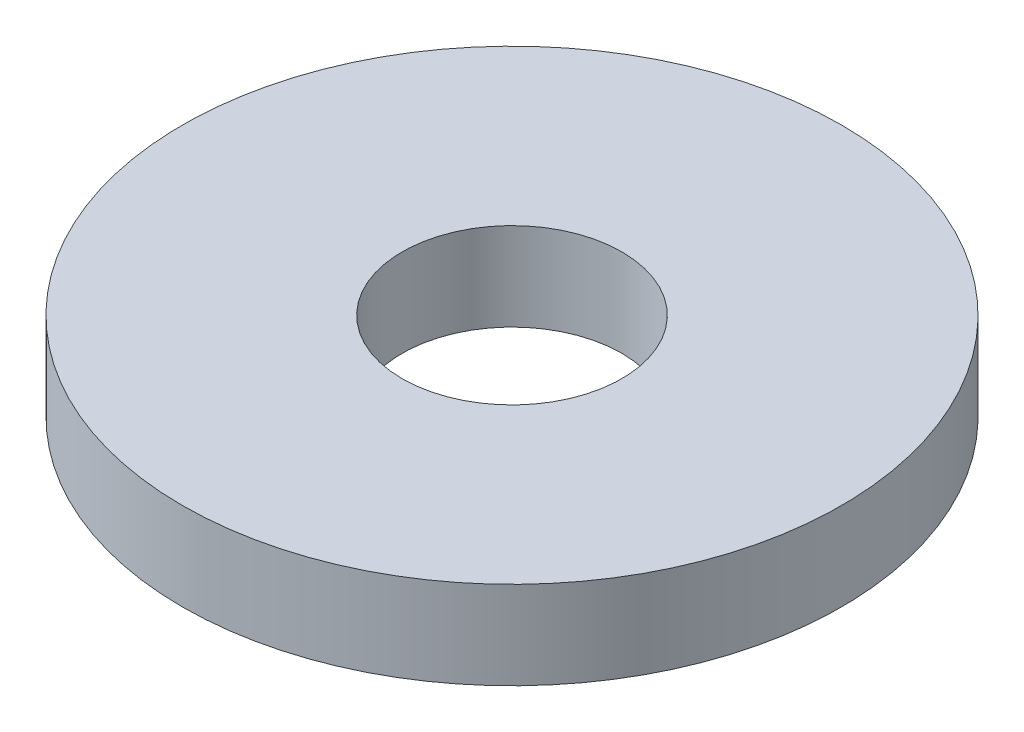
ISO-10303-21;
HEADER;
FILE_DESCRIPTION(('STEP AP214'),'2;1');
FILE_NAME('part.step','',(''),(''),'','','');
FILE_SCHEMA(('AUTOMOTIVE_DESIGN { 1 0 10303 214 1 1 1 1 }'));
ENDSEC;
DATA;
#1=APPLICATION_CONTEXT('core data for automotive mechanical design processes');
#2=APPLICATION_PROTOCOL_DEFINITION('international standard','automotive_design',2000,#1);
#3=PRODUCT_CONTEXT('',#1,'mechanical');
#4=PRODUCT('Part','Part','',(#3));
#5=PRODUCT_RELATED_PRODUCT_CATEGORY('part','',(#4));
#6=PRODUCT_DEFINITION_FORMATION('','',#4);
#7=PRODUCT_DEFINITION_CONTEXT('part definition',#1,'design');
#8=PRODUCT_DEFINITION('design','',#6,#7);
#9=PRODUCT_DEFINITION_SHAPE('','',#8);
#10=(LENGTH_UNIT() NAMED_UNIT(*) SI_UNIT(.MILLI.,.METRE.));
#11=(NAMED_UNIT(*) PLANE_ANGLE_UNIT() SI_UNIT($,.RADIAN.));
#12=(NAMED_UNIT(*) SI_UNIT($,.STERADIAN.) SOLID_ANGLE_UNIT());
#13=UNCERTAINTY_MEASURE_WITH_UNIT(LENGTH_MEASURE(1.E-05),#10,'distance_accuracy_value','');
#14=(GEOMETRIC_REPRESENTATION_CONTEXT(3) GLOBAL_UNCERTAINTY_ASSIGNED_CONTEXT((#13)) GLOBAL_UNIT_ASSIGNED_CONTEXT((#10,
#11,#12)) REPRESENTATION_CONTEXT('',''));
#15=CARTESIAN_POINT('',(0.,0.,0.));
#16=DIRECTION('',(0.,0.,1.));
#17=DIRECTION('',(1.,0.,0.));
#18=AXIS2_PLACEMENT_3D('',#15,#16,#17);
#19=CARTESIAN_POINT('',(0.,4.,0.));
#20=DIRECTION('',(0.,1.,0.));
#21=DIRECTION('',(0.,0.,1.));
#22=AXIS2_PLACEMENT_3D('',#19,#20,#21);
#23=PLANE('',#22);
#24=CARTESIAN_POINT('',(0.,4.,0.));
#25=DIRECTION('',(0.,1.,0.));
#26=DIRECTION('',(0.,0.,1.));
#27=AXIS2_PLACEMENT_3D('',#24,#25,#26);
#28=CIRCLE('',#27,15.);
#29=CARTESIAN_POINT('',(0.,4.,15.));
#30=VERTEX_POINT('',#29);
#31=EDGE_CURVE('E10',#30,#30,#28,.T.);
#32=ORIENTED_EDGE('',*,*,#31,.T.);
#33=EDGE_LOOP('',(#32));
#34=FACE_BOUND('',#33,.T.);
#35=CARTESIAN_POINT('',(0.,4.,0.));
#36=DIRECTION('',(0.,1.,0.));
#37=DIRECTION('',(0.,0.,1.));
#38=AXIS2_PLACEMENT_3D('',#35,#36,#37);
#39=CIRCLE('',#38,5.);
#40=CARTESIAN_POINT('',(0.,4.,5.));
#41=VERTEX_POINT('',#40);
#42=EDGE_CURVE('E50',#41,#41,#39,.T.);
#43=ORIENTED_EDGE('',*,*,#42,.F.);
#44=EDGE_LOOP('',(#43));
#45=FACE_BOUND('',#44,.T.);
#46=ADVANCED_FACE('F37',(#34,#45),#23,.T.);
#47=CARTESIAN_POINT('',(0.,0.,0.));
#48=DIRECTION('',(0.,1.,0.));
#49=DIRECTION('',(0.,0.,1.));
#50=AXIS2_PLACEMENT_3D('',#47,#48,#49);
#51=PLANE('',#50);
#52=CARTESIAN_POINT('',(0.,0.,0.));
#53=DIRECTION('',(0.,1.,0.));
#54=DIRECTION('',(0.,0.,1.));
#55=AXIS2_PLACEMENT_3D('',#52,#53,#54);
#56=CIRCLE('',#55,15.);
#57=CARTESIAN_POINT('',(0.,0.,15.));
#58=VERTEX_POINT('',#57);
#59=EDGE_CURVE('E41',#58,#58,#56,.T.);
#60=ORIENTED_EDGE('',*,*,#59,.F.);
#61=EDGE_LOOP('',(#60));
#62=FACE_BOUND('',#61,.T.);
#63=CARTESIAN_POINT('',(0.,0.,0.));
#64=DIRECTION('',(0.,1.,0.));
#65=DIRECTION('',(0.,0.,1.));
#66=AXIS2_PLACEMENT_3D('',#63,#64,#65);
#67=CIRCLE('',#66,5.);
#68=CARTESIAN_POINT('',(0.,0.,5.));
#69=VERTEX_POINT('',#68);
#70=EDGE_CURVE('E52',#69,#69,#67,.T.);
#71=ORIENTED_EDGE('',*,*,#70,.T.);
#72=EDGE_LOOP('',(#71));
#73=FACE_BOUND('',#72,.T.);
#74=ADVANCED_FACE('F64',(#62,#73),#51,.F.);
#75=CARTESIAN_POINT('',(0.,4.,0.));
#76=DIRECTION('',(0.,-1.,0.));
#77=DIRECTION('',(0.,0.,-1.));
#78=AXIS2_PLACEMENT_3D('',#75,#76,#77);
#79=CYLINDRICAL_SURFACE('',#78,15.);
#80=ORIENTED_EDGE('',*,*,#31,.F.);
#81=EDGE_LOOP('',(#80));
#82=FACE_BOUND('',#81,.T.);
#83=ORIENTED_EDGE('',*,*,#59,.T.);
#84=EDGE_LOOP('',(#83));
#85=FACE_BOUND('',#84,.T.);
#86=ADVANCED_FACE('F39',(#82,#85),#79,.T.);
#87=CARTESIAN_POINT('',(0.,4.,0.));
#88=DIRECTION('',(0.,-1.,0.));
#89=DIRECTION('',(0.,0.,-1.));
#90=AXIS2_PLACEMENT_3D('',#87,#88,#89);
#91=CYLINDRICAL_SURFACE('',#90,5.);
#92=ORIENTED_EDGE('',*,*,#42,.T.);
#93=EDGE_LOOP('',(#92));
#94=FACE_BOUND('',#93,.T.);
#95=ORIENTED_EDGE('',*,*,#70,.F.);
#96=EDGE_LOOP('',(#95));
#97=FACE_BOUND('',#96,.T.);
#98=ADVANCED_FACE('F60',(#94,#97),#91,.F.);
#99=CLOSED_SHELL('',(#46,#74,#86,#98));
#100=MANIFOLD_SOLID_BREP('B2',#99);
#101=ADVANCED_BREP_SHAPE_REPRESENTATION('',(#18,#100),#14);
#102=SHAPE_DEFINITION_REPRESENTATION(#9,#101);
ENDSEC;
END-ISO-10303-21;
